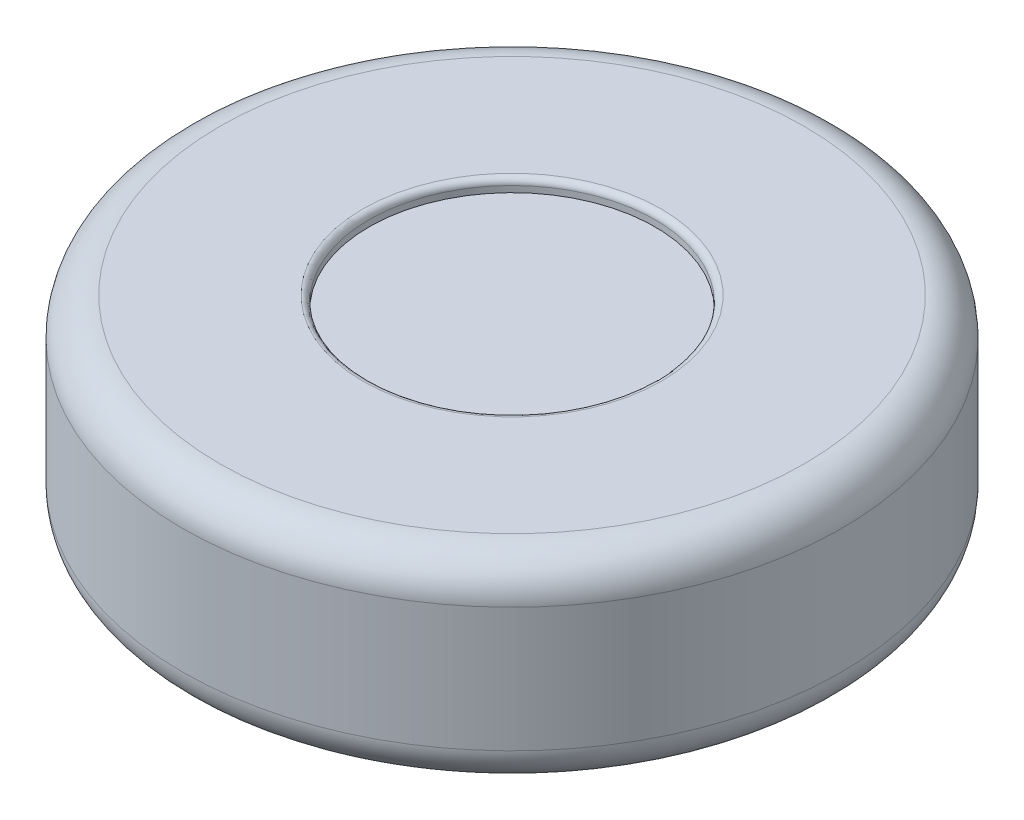
ISO-10303-21;
HEADER;
FILE_DESCRIPTION(('STEP AP214'),'2;1');
FILE_NAME('part.step','',(''),(''),'','','');
FILE_SCHEMA(('AUTOMOTIVE_DESIGN { 1 0 10303 214 1 1 1 1 }'));
ENDSEC;
DATA;
#1=APPLICATION_CONTEXT('core data for automotive mechanical design processes');
#2=APPLICATION_PROTOCOL_DEFINITION('international standard','automotive_design',2000,#1);
#3=PRODUCT_CONTEXT('',#1,'mechanical');
#4=PRODUCT('Part','Part','',(#3));
#5=PRODUCT_RELATED_PRODUCT_CATEGORY('part','',(#4));
#6=PRODUCT_DEFINITION_FORMATION('','',#4);
#7=PRODUCT_DEFINITION_CONTEXT('part definition',#1,'design');
#8=PRODUCT_DEFINITION('design','',#6,#7);
#9=PRODUCT_DEFINITION_SHAPE('','',#8);
#10=(LENGTH_UNIT() NAMED_UNIT(*) SI_UNIT(.MILLI.,.METRE.));
#11=(NAMED_UNIT(*) PLANE_ANGLE_UNIT() SI_UNIT($,.RADIAN.));
#12=(NAMED_UNIT(*) SI_UNIT($,.STERADIAN.) SOLID_ANGLE_UNIT());
#13=UNCERTAINTY_MEASURE_WITH_UNIT(LENGTH_MEASURE(1.E-05),#10,'distance_accuracy_value','');
#14=(GEOMETRIC_REPRESENTATION_CONTEXT(3) GLOBAL_UNCERTAINTY_ASSIGNED_CONTEXT((#13)) GLOBAL_UNIT_ASSIGNED_CONTEXT((#10,
#11,#12)) REPRESENTATION_CONTEXT('',''));
#15=CARTESIAN_POINT('',(0.,0.,0.));
#16=DIRECTION('',(0.,0.,1.));
#17=DIRECTION('',(1.,0.,0.));
#18=AXIS2_PLACEMENT_3D('',#15,#16,#17);
#19=CARTESIAN_POINT('',(0.,140.,0.));
#20=DIRECTION('',(0.,1.,0.));
#21=DIRECTION('',(0.,0.,1.));
#22=AXIS2_PLACEMENT_3D('',#19,#20,#21);
#23=PLANE('',#22);
#24=CARTESIAN_POINT('',(0.,140.,0.));
#25=DIRECTION('',(0.,1.,0.));
#26=DIRECTION('',(0.,0.,1.));
#27=AXIS2_PLACEMENT_3D('',#24,#25,#26);
#28=CIRCLE('',#27,115.);
#29=CARTESIAN_POINT('',(0.,140.,115.));
#30=VERTEX_POINT('',#29);
#31=EDGE_CURVE('E81',#30,#30,#28,.T.);
#32=ORIENTED_EDGE('',*,*,#31,.T.);
#33=EDGE_LOOP('',(#32));
#34=FACE_BOUND('',#33,.T.);
#35=ADVANCED_FACE('F37',(#34),#23,.T.);
#36=CARTESIAN_POINT('',(0.,-9.99999999999999,0.));
#37=DIRECTION('',(0.,1.,0.));
#38=DIRECTION('',(0.,0.,1.));
#39=AXIS2_PLACEMENT_3D('',#36,#37,#38);
#40=CYLINDRICAL_SURFACE('',#39,115.);
#41=CARTESIAN_POINT('',(0.,-4.99999999999999,0.));
#42=DIRECTION('',(0.,1.,0.));
#43=DIRECTION('',(0.,0.,1.));
#44=AXIS2_PLACEMENT_3D('',#41,#42,#43);
#45=CIRCLE('',#44,115.);
#46=CARTESIAN_POINT('',(0.,-4.99999999999999,115.));
#47=VERTEX_POINT('',#46);
#48=EDGE_CURVE('E50',#47,#47,#45,.F.);
#49=ORIENTED_EDGE('',*,*,#48,.T.);
#50=EDGE_LOOP('',(#49));
#51=FACE_BOUND('',#50,.T.);
#52=CARTESIAN_POINT('',(0.,0.,0.));
#53=DIRECTION('',(0.,1.,0.));
#54=DIRECTION('',(0.,0.,1.));
#55=AXIS2_PLACEMENT_3D('',#52,#53,#54);
#56=CIRCLE('',#55,115.);
#57=CARTESIAN_POINT('',(0.,0.,115.));
#58=VERTEX_POINT('',#57);
#59=EDGE_CURVE('E77',#58,#58,#56,.T.);
#60=ORIENTED_EDGE('',*,*,#59,.T.);
#61=EDGE_LOOP('',(#60));
#62=FACE_BOUND('',#61,.T.);
#63=ADVANCED_FACE('F92',(#51,#62),#40,.F.);
#64=CARTESIAN_POINT('',(0.,-9.99999999999999,0.));
#65=DIRECTION('',(0.,1.,0.));
#66=DIRECTION('',(0.,0.,1.));
#67=AXIS2_PLACEMENT_3D('',#64,#65,#66);
#68=CYLINDRICAL_SURFACE('',#67,265.);
#69=CARTESIAN_POINT('',(0.,120.,0.));
#70=DIRECTION('',(0.,1.,0.));
#71=DIRECTION('',(0.,0.,1.));
#72=AXIS2_PLACEMENT_3D('',#69,#70,#71);
#73=CIRCLE('',#72,265.);
#74=CARTESIAN_POINT('',(0.,120.,265.));
#75=VERTEX_POINT('',#74);
#76=EDGE_CURVE('E65',#75,#75,#73,.F.);
#77=ORIENTED_EDGE('',*,*,#76,.T.);
#78=EDGE_LOOP('',(#77));
#79=FACE_BOUND('',#78,.T.);
#80=CARTESIAN_POINT('',(0.,20.,0.));
#81=DIRECTION('',(0.,1.,0.));
#82=DIRECTION('',(0.,0.,1.));
#83=AXIS2_PLACEMENT_3D('',#80,#81,#82);
#84=CIRCLE('',#83,265.);
#85=CARTESIAN_POINT('',(0.,20.,265.));
#86=VERTEX_POINT('',#85);
#87=EDGE_CURVE('E69',#86,#86,#84,.T.);
#88=ORIENTED_EDGE('',*,*,#87,.T.);
#89=EDGE_LOOP('',(#88));
#90=FACE_BOUND('',#89,.T.);
#91=ADVANCED_FACE('F99',(#79,#90),#68,.T.);
#92=CARTESIAN_POINT('',(0.,-9.99999999999999,0.));
#93=DIRECTION('',(0.,1.,0.));
#94=DIRECTION('',(0.,0.,1.));
#95=AXIS2_PLACEMENT_3D('',#92,#93,#94);
#96=PLANE('',#95);
#97=CARTESIAN_POINT('',(0.,-9.99999999999999,0.));
#98=DIRECTION('',(0.,1.,0.));
#99=DIRECTION('',(0.,0.,1.));
#100=AXIS2_PLACEMENT_3D('',#97,#98,#99);
#101=CIRCLE('',#100,120.);
#102=CARTESIAN_POINT('',(0.,-9.99999999999999,120.));
#103=VERTEX_POINT('',#102);
#104=EDGE_CURVE('E55',#103,#103,#101,.T.);
#105=ORIENTED_EDGE('',*,*,#104,.T.);
#106=EDGE_LOOP('',(#105));
#107=FACE_BOUND('',#106,.T.);
#108=CARTESIAN_POINT('',(0.,-9.99999999999999,0.));
#109=DIRECTION('',(0.,1.,0.));
#110=DIRECTION('',(0.,0.,1.));
#111=AXIS2_PLACEMENT_3D('',#108,#109,#110);
#112=CIRCLE('',#111,235.);
#113=CARTESIAN_POINT('',(0.,-9.99999999999999,235.));
#114=VERTEX_POINT('',#113);
#115=EDGE_CURVE('E61',#114,#114,#112,.F.);
#116=ORIENTED_EDGE('',*,*,#115,.T.);
#117=EDGE_LOOP('',(#116));
#118=FACE_BOUND('',#117,.T.);
#119=ADVANCED_FACE('F90',(#107,#118),#96,.F.);
#120=CARTESIAN_POINT('',(0.,145.,0.));
#121=DIRECTION('',(0.,1.,0.));
#122=DIRECTION('',(0.,0.,1.));
#123=AXIS2_PLACEMENT_3D('',#120,#121,#122);
#124=CIRCLE('',#123,115.);
#125=CARTESIAN_POINT('',(0.,145.,115.));
#126=VERTEX_POINT('',#125);
#127=EDGE_CURVE('E45',#126,#126,#124,.T.);
#128=ORIENTED_EDGE('',*,*,#127,.T.);
#129=EDGE_LOOP('',(#128));
#130=FACE_BOUND('',#129,.T.);
#131=ORIENTED_EDGE('',*,*,#31,.F.);
#132=EDGE_LOOP('',(#131));
#133=FACE_BOUND('',#132,.T.);
#134=ADVANCED_FACE('F87',(#130,#133),#40,.F.);
#135=CARTESIAN_POINT('',(0.,150.,0.));
#136=DIRECTION('',(0.,1.,0.));
#137=DIRECTION('',(0.,0.,1.));
#138=AXIS2_PLACEMENT_3D('',#135,#136,#137);
#139=PLANE('',#138);
#140=CARTESIAN_POINT('',(0.,150.,0.));
#141=DIRECTION('',(0.,1.,0.));
#142=DIRECTION('',(0.,0.,1.));
#143=AXIS2_PLACEMENT_3D('',#140,#141,#142);
#144=CIRCLE('',#143,120.);
#145=CARTESIAN_POINT('',(0.,150.,120.));
#146=VERTEX_POINT('',#145);
#147=EDGE_CURVE('E10',#146,#146,#144,.F.);
#148=ORIENTED_EDGE('',*,*,#147,.T.);
#149=EDGE_LOOP('',(#148));
#150=FACE_BOUND('',#149,.T.);
#151=CARTESIAN_POINT('',(0.,150.,0.));
#152=DIRECTION('',(0.,1.,0.));
#153=DIRECTION('',(0.,0.,1.));
#154=AXIS2_PLACEMENT_3D('',#151,#152,#153);
#155=CIRCLE('',#154,235.);
#156=CARTESIAN_POINT('',(0.,150.,235.));
#157=VERTEX_POINT('',#156);
#158=EDGE_CURVE('E73',#157,#157,#155,.T.);
#159=ORIENTED_EDGE('',*,*,#158,.T.);
#160=EDGE_LOOP('',(#159));
#161=FACE_BOUND('',#160,.T.);
#162=ADVANCED_FACE('F89',(#150,#161),#139,.T.);
#163=CARTESIAN_POINT('',(0.,0.,0.));
#164=DIRECTION('',(0.,1.,0.));
#165=DIRECTION('',(0.,0.,1.));
#166=AXIS2_PLACEMENT_3D('',#163,#164,#165);
#167=PLANE('',#166);
#168=ORIENTED_EDGE('',*,*,#59,.F.);
#169=EDGE_LOOP('',(#168));
#170=FACE_BOUND('',#169,.T.);
#171=ADVANCED_FACE('F97',(#170),#167,.F.);
#172=CARTESIAN_POINT('',(0.,120.,0.));
#173=DIRECTION('',(0.,1.,0.));
#174=DIRECTION('',(0.,0.,1.));
#175=AXIS2_PLACEMENT_3D('',#172,#173,#174);
#176=TOROIDAL_SURFACE('',#175,235.,30.);
#177=ORIENTED_EDGE('',*,*,#76,.F.);
#178=EDGE_LOOP('',(#177));
#179=FACE_BOUND('',#178,.T.);
#180=ORIENTED_EDGE('',*,*,#158,.F.);
#181=EDGE_LOOP('',(#180));
#182=FACE_BOUND('',#181,.T.);
#183=ADVANCED_FACE('F112',(#179,#182),#176,.T.);
#184=CARTESIAN_POINT('',(0.,20.,0.));
#185=DIRECTION('',(0.,1.,0.));
#186=DIRECTION('',(0.,0.,1.));
#187=AXIS2_PLACEMENT_3D('',#184,#185,#186);
#188=TOROIDAL_SURFACE('',#187,235.,30.);
#189=ORIENTED_EDGE('',*,*,#115,.F.);
#190=EDGE_LOOP('',(#189));
#191=FACE_BOUND('',#190,.T.);
#192=ORIENTED_EDGE('',*,*,#87,.F.);
#193=EDGE_LOOP('',(#192));
#194=FACE_BOUND('',#193,.T.);
#195=ADVANCED_FACE('F116',(#191,#194),#188,.T.);
#196=CARTESIAN_POINT('',(0.,-4.99999999999999,0.));
#197=DIRECTION('',(0.,1.,0.));
#198=DIRECTION('',(0.,0.,1.));
#199=AXIS2_PLACEMENT_3D('',#196,#197,#198);
#200=TOROIDAL_SURFACE('',#199,120.,5.);
#201=ORIENTED_EDGE('',*,*,#48,.F.);
#202=EDGE_LOOP('',(#201));
#203=FACE_BOUND('',#202,.T.);
#204=ORIENTED_EDGE('',*,*,#104,.F.);
#205=EDGE_LOOP('',(#204));
#206=FACE_BOUND('',#205,.T.);
#207=ADVANCED_FACE('F119',(#203,#206),#200,.T.);
#208=CARTESIAN_POINT('',(0.,145.,0.));
#209=DIRECTION('',(0.,1.,0.));
#210=DIRECTION('',(0.,0.,1.));
#211=AXIS2_PLACEMENT_3D('',#208,#209,#210);
#212=TOROIDAL_SURFACE('',#211,120.,5.);
#213=ORIENTED_EDGE('',*,*,#147,.F.);
#214=EDGE_LOOP('',(#213));
#215=FACE_BOUND('',#214,.T.);
#216=ORIENTED_EDGE('',*,*,#127,.F.);
#217=EDGE_LOOP('',(#216));
#218=FACE_BOUND('',#217,.T.);
#219=ADVANCED_FACE('F39',(#215,#218),#212,.T.);
#220=CLOSED_SHELL('',(#35,#63,#91,#119,#134,#162,#171,#183,#195,#207,#219));
#221=MANIFOLD_SOLID_BREP('B2',#220);
#222=ADVANCED_BREP_SHAPE_REPRESENTATION('',(#18,#221),#14);
#223=SHAPE_DEFINITION_REPRESENTATION(#9,#222);
ENDSEC;
END-ISO-10303-21;
